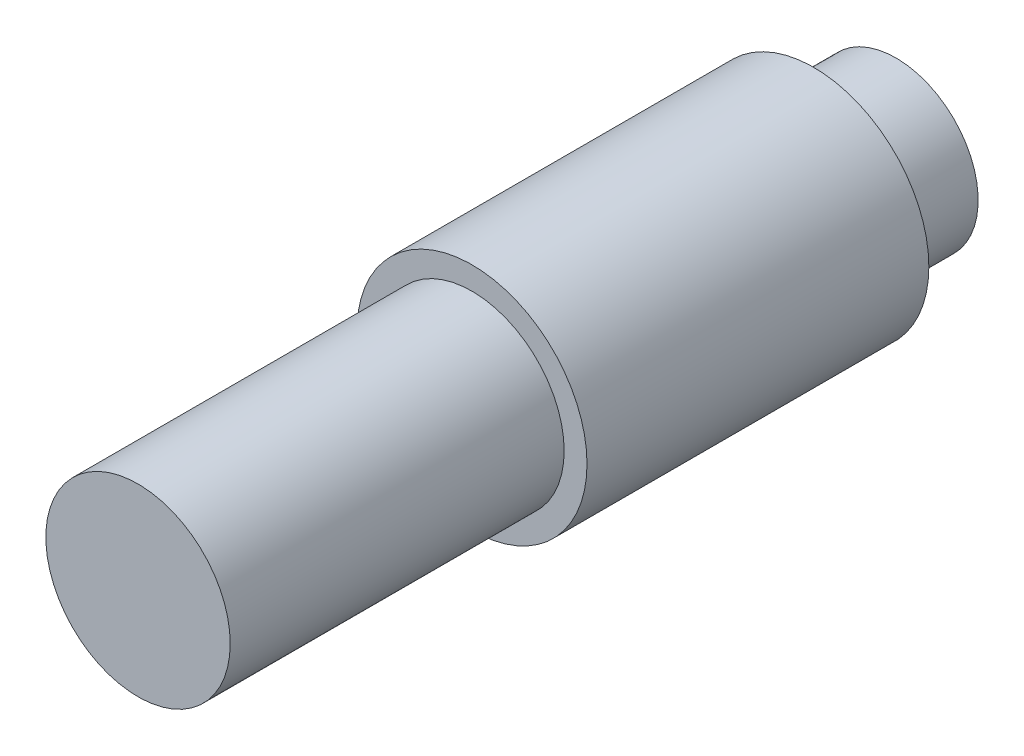
ISO-10303-21;
HEADER;
FILE_DESCRIPTION(('STEP AP214'),'2;1');
FILE_NAME('part.step','',(''),(''),'','','');
FILE_SCHEMA(('AUTOMOTIVE_DESIGN { 1 0 10303 214 1 1 1 1 }'));
ENDSEC;
DATA;
#1=APPLICATION_CONTEXT('core data for automotive mechanical design processes');
#2=APPLICATION_PROTOCOL_DEFINITION('international standard','automotive_design',2000,#1);
#3=PRODUCT_CONTEXT('',#1,'mechanical');
#4=PRODUCT('Part','Part','',(#3));
#5=PRODUCT_RELATED_PRODUCT_CATEGORY('part','',(#4));
#6=PRODUCT_DEFINITION_FORMATION('','',#4);
#7=PRODUCT_DEFINITION_CONTEXT('part definition',#1,'design');
#8=PRODUCT_DEFINITION('design','',#6,#7);
#9=PRODUCT_DEFINITION_SHAPE('','',#8);
#10=(LENGTH_UNIT() NAMED_UNIT(*) SI_UNIT(.MILLI.,.METRE.));
#11=(NAMED_UNIT(*) PLANE_ANGLE_UNIT() SI_UNIT($,.RADIAN.));
#12=(NAMED_UNIT(*) SI_UNIT($,.STERADIAN.) SOLID_ANGLE_UNIT());
#13=UNCERTAINTY_MEASURE_WITH_UNIT(LENGTH_MEASURE(1.E-05),#10,'distance_accuracy_value','');
#14=(GEOMETRIC_REPRESENTATION_CONTEXT(3) GLOBAL_UNCERTAINTY_ASSIGNED_CONTEXT((#13)) GLOBAL_UNIT_ASSIGNED_CONTEXT((#10,
#11,#12)) REPRESENTATION_CONTEXT('',''));
#15=CARTESIAN_POINT('',(0.,0.,0.));
#16=DIRECTION('',(0.,0.,1.));
#17=DIRECTION('',(1.,0.,0.));
#18=AXIS2_PLACEMENT_3D('',#15,#16,#17);
#19=CARTESIAN_POINT('',(0.,0.,52.));
#20=DIRECTION('',(0.,0.,-1.));
#21=DIRECTION('',(-1.,0.,0.));
#22=AXIS2_PLACEMENT_3D('',#19,#20,#21);
#23=CYLINDRICAL_SURFACE('',#22,17.5);
#24=CARTESIAN_POINT('',(0.,0.,52.));
#25=DIRECTION('',(0.,0.,1.));
#26=DIRECTION('',(1.,0.,0.));
#27=AXIS2_PLACEMENT_3D('',#24,#25,#26);
#28=CIRCLE('',#27,17.5);
#29=CARTESIAN_POINT('',(17.5,0.,52.));
#30=VERTEX_POINT('',#29);
#31=EDGE_CURVE('E47',#30,#30,#28,.T.);
#32=ORIENTED_EDGE('',*,*,#31,.F.);
#33=EDGE_LOOP('',(#32));
#34=FACE_BOUND('',#33,.T.);
#35=CARTESIAN_POINT('',(0.,0.,0.));
#36=DIRECTION('',(0.,0.,1.));
#37=DIRECTION('',(1.,0.,0.));
#38=AXIS2_PLACEMENT_3D('',#35,#36,#37);
#39=CIRCLE('',#38,17.5);
#40=CARTESIAN_POINT('',(17.5,0.,0.));
#41=VERTEX_POINT('',#40);
#42=EDGE_CURVE('E38',#41,#41,#39,.T.);
#43=ORIENTED_EDGE('',*,*,#42,.T.);
#44=EDGE_LOOP('',(#43));
#45=FACE_BOUND('',#44,.T.);
#46=ADVANCED_FACE('F35',(#34,#45),#23,.T.);
#47=CARTESIAN_POINT('',(0.,0.,52.));
#48=DIRECTION('',(0.,0.,1.));
#49=DIRECTION('',(1.,0.,0.));
#50=AXIS2_PLACEMENT_3D('',#47,#48,#49);
#51=PLANE('',#50);
#52=CARTESIAN_POINT('',(0.,0.,52.));
#53=DIRECTION('',(0.,0.,1.));
#54=DIRECTION('',(1.,0.,0.));
#55=AXIS2_PLACEMENT_3D('',#52,#53,#54);
#56=CIRCLE('',#55,14.0250000000004);
#57=CARTESIAN_POINT('',(14.0250000000004,0.,52.));
#58=VERTEX_POINT('',#57);
#59=EDGE_CURVE('E42',#58,#58,#56,.T.);
#60=ORIENTED_EDGE('',*,*,#59,.F.);
#61=EDGE_LOOP('',(#60));
#62=FACE_BOUND('',#61,.T.);
#63=ORIENTED_EDGE('',*,*,#31,.T.);
#64=EDGE_LOOP('',(#63));
#65=FACE_BOUND('',#64,.T.);
#66=ADVANCED_FACE('F64',(#62,#65),#51,.T.);
#67=CARTESIAN_POINT('',(0.,0.,0.));
#68=DIRECTION('',(0.,0.,1.));
#69=DIRECTION('',(1.,0.,0.));
#70=AXIS2_PLACEMENT_3D('',#67,#68,#69);
#71=PLANE('',#70);
#72=CARTESIAN_POINT('',(0.,0.,0.));
#73=DIRECTION('',(0.,0.,-1.));
#74=DIRECTION('',(-1.,0.,0.));
#75=AXIS2_PLACEMENT_3D('',#72,#73,#74);
#76=CIRCLE('',#75,12.5);
#77=CARTESIAN_POINT('',(-12.5,0.,0.));
#78=VERTEX_POINT('',#77);
#79=EDGE_CURVE('E10',#78,#78,#76,.T.);
#80=ORIENTED_EDGE('',*,*,#79,.F.);
#81=EDGE_LOOP('',(#80));
#82=FACE_BOUND('',#81,.T.);
#83=ORIENTED_EDGE('',*,*,#42,.F.);
#84=EDGE_LOOP('',(#83));
#85=FACE_BOUND('',#84,.T.);
#86=ADVANCED_FACE('F61',(#82,#85),#71,.F.);
#87=CARTESIAN_POINT('',(0.,0.,102.8));
#88=DIRECTION('',(0.,0.,-1.));
#89=DIRECTION('',(-1.,0.,0.));
#90=AXIS2_PLACEMENT_3D('',#87,#88,#89);
#91=CYLINDRICAL_SURFACE('',#90,14.0250000000004);
#92=CARTESIAN_POINT('',(0.,0.,102.8));
#93=DIRECTION('',(0.,0.,1.));
#94=DIRECTION('',(1.,0.,0.));
#95=AXIS2_PLACEMENT_3D('',#92,#93,#94);
#96=CIRCLE('',#95,14.0250000000004);
#97=CARTESIAN_POINT('',(14.0250000000004,0.,102.8));
#98=VERTEX_POINT('',#97);
#99=EDGE_CURVE('E52',#98,#98,#96,.T.);
#100=ORIENTED_EDGE('',*,*,#99,.F.);
#101=EDGE_LOOP('',(#100));
#102=FACE_BOUND('',#101,.T.);
#103=ORIENTED_EDGE('',*,*,#59,.T.);
#104=EDGE_LOOP('',(#103));
#105=FACE_BOUND('',#104,.T.);
#106=ADVANCED_FACE('F63',(#102,#105),#91,.T.);
#107=CARTESIAN_POINT('',(0.,0.,102.8));
#108=DIRECTION('',(0.,0.,1.));
#109=DIRECTION('',(1.,0.,0.));
#110=AXIS2_PLACEMENT_3D('',#107,#108,#109);
#111=PLANE('',#110);
#112=ORIENTED_EDGE('',*,*,#99,.T.);
#113=EDGE_LOOP('',(#112));
#114=FACE_BOUND('',#113,.T.);
#115=ADVANCED_FACE('F70',(#114),#111,.T.);
#116=CARTESIAN_POINT('',(0.,0.,-12.5));
#117=DIRECTION('',(0.,0.,1.));
#118=DIRECTION('',(1.,0.,0.));
#119=AXIS2_PLACEMENT_3D('',#116,#117,#118);
#120=CYLINDRICAL_SURFACE('',#119,12.5);
#121=CARTESIAN_POINT('',(0.,0.,-12.5));
#122=DIRECTION('',(0.,0.,-1.));
#123=DIRECTION('',(-1.,0.,0.));
#124=AXIS2_PLACEMENT_3D('',#121,#122,#123);
#125=CIRCLE('',#124,12.5);
#126=CARTESIAN_POINT('',(-12.5,0.,-12.5));
#127=VERTEX_POINT('',#126);
#128=EDGE_CURVE('E51',#127,#127,#125,.T.);
#129=ORIENTED_EDGE('',*,*,#128,.F.);
#130=EDGE_LOOP('',(#129));
#131=FACE_BOUND('',#130,.T.);
#132=ORIENTED_EDGE('',*,*,#79,.T.);
#133=EDGE_LOOP('',(#132));
#134=FACE_BOUND('',#133,.T.);
#135=ADVANCED_FACE('F100',(#131,#134),#120,.T.);
#136=CARTESIAN_POINT('',(0.,0.,-12.5));
#137=DIRECTION('',(0.,0.,-1.));
#138=DIRECTION('',(-1.,0.,0.));
#139=AXIS2_PLACEMENT_3D('',#136,#137,#138);
#140=PLANE('',#139);
#141=ORIENTED_EDGE('',*,*,#128,.T.);
#142=EDGE_LOOP('',(#141));
#143=FACE_BOUND('',#142,.T.);
#144=ADVANCED_FACE('F116',(#143),#140,.T.);
#145=CLOSED_SHELL('',(#46,#66,#86,#106,#115,#135,#144));
#146=MANIFOLD_SOLID_BREP('B2',#145);
#147=ADVANCED_BREP_SHAPE_REPRESENTATION('',(#18,#146),#14);
#148=SHAPE_DEFINITION_REPRESENTATION(#9,#147);
ENDSEC;
END-ISO-10303-21;
